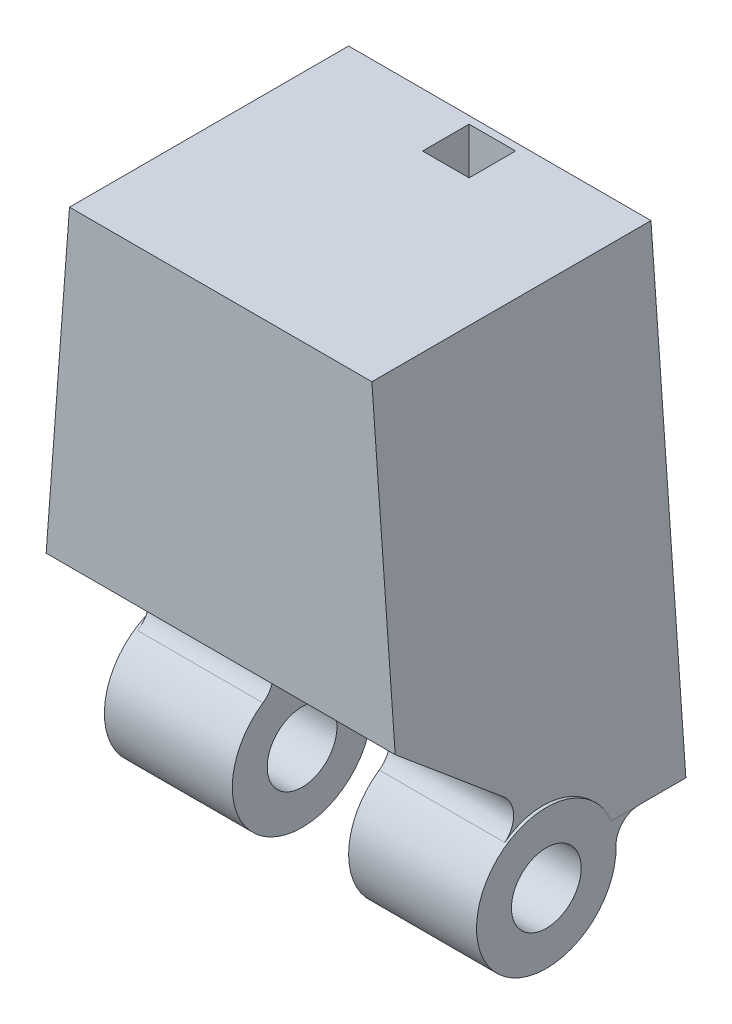
ISO-10303-21;
HEADER;
FILE_DESCRIPTION(('STEP AP214'),'2;1');
FILE_NAME('part.step','',(''),(''),'','','');
FILE_SCHEMA(('AUTOMOTIVE_DESIGN { 1 0 10303 214 1 1 1 1 }'));
ENDSEC;
DATA;
#1=APPLICATION_CONTEXT('core data for automotive mechanical design processes');
#2=APPLICATION_PROTOCOL_DEFINITION('international standard','automotive_design',2000,#1);
#3=PRODUCT_CONTEXT('',#1,'mechanical');
#4=PRODUCT('Part','Part','',(#3));
#5=PRODUCT_RELATED_PRODUCT_CATEGORY('part','',(#4));
#6=PRODUCT_DEFINITION_FORMATION('','',#4);
#7=PRODUCT_DEFINITION_CONTEXT('part definition',#1,'design');
#8=PRODUCT_DEFINITION('design','',#6,#7);
#9=PRODUCT_DEFINITION_SHAPE('','',#8);
#10=(LENGTH_UNIT() NAMED_UNIT(*) SI_UNIT(.MILLI.,.METRE.));
#11=(NAMED_UNIT(*) PLANE_ANGLE_UNIT() SI_UNIT($,.RADIAN.));
#12=(NAMED_UNIT(*) SI_UNIT($,.STERADIAN.) SOLID_ANGLE_UNIT());
#13=UNCERTAINTY_MEASURE_WITH_UNIT(LENGTH_MEASURE(1.E-05),#10,'distance_accuracy_value','');
#14=(GEOMETRIC_REPRESENTATION_CONTEXT(3) GLOBAL_UNCERTAINTY_ASSIGNED_CONTEXT((#13)) GLOBAL_UNIT_ASSIGNED_CONTEXT((#10,
#11,#12)) REPRESENTATION_CONTEXT('',''));
#15=CARTESIAN_POINT('',(0.,0.,0.));
#16=DIRECTION('',(0.,0.,1.));
#17=DIRECTION('',(1.,0.,0.));
#18=AXIS2_PLACEMENT_3D('',#15,#16,#17);
#19=CARTESIAN_POINT('',(-8.,-10.,4.));
#20=DIRECTION('',(0.,0.770712909441233,-0.637182557216242));
#21=DIRECTION('',(0.,0.637182557216242,0.770712909441233));
#22=AXIS2_PLACEMENT_3D('',#19,#20,#21);
#23=PLANE('',#22);
#24=DIRECTION('',(-1.,0.,0.));
#25=VECTOR('',#24,1.);
#26=CARTESIAN_POINT('',(8.,-8.11329221864349,6.28209329801413));
#27=LINE('',#26,#25);
#28=CARTESIAN_POINT('',(2.5,-8.11329221864349,6.28209329801413));
#29=VERTEX_POINT('',#28);
#30=CARTESIAN_POINT('',(-2.5,-8.11329221864349,6.28209329801413));
#31=VERTEX_POINT('',#30);
#32=EDGE_CURVE('E374',#29,#31,#27,.T.);
#33=ORIENTED_EDGE('',*,*,#32,.F.);
#34=DIRECTION('',(0.,0.637182557216242,0.770712909441233));
#35=VECTOR('',#34,1.);
#36=CARTESIAN_POINT('',(2.5,-9.46443212730802,4.64780347278967));
#37=LINE('',#36,#35);
#38=CARTESIAN_POINT('',(2.5,-7.01805096276244,7.60685739474015));
#39=VERTEX_POINT('',#38);
#40=EDGE_CURVE('E392',#29,#39,#37,.T.);
#41=ORIENTED_EDGE('',*,*,#40,.T.);
#42=DIRECTION('',(1.,0.,0.));
#43=VECTOR('',#42,1.);
#44=CARTESIAN_POINT('',(7.85849691639826,-7.01805096276244,7.60685739474015));
#45=LINE('',#44,#43);
#46=CARTESIAN_POINT('',(7.77635382220718,-7.01805096276244,7.60685739474015));
#47=VERTEX_POINT('',#46);
#48=EDGE_CURVE('E389',#39,#47,#45,.T.);
#49=ORIENTED_EDGE('',*,*,#48,.T.);
#50=DIRECTION('',(0.0477342161514117,-0.636456215352155,-0.769834352668171));
#51=VECTOR('',#50,1.);
#52=CARTESIAN_POINT('',(7.70602048487164,-6.08027313162191,8.74115944438417));
#53=LINE('',#52,#51);
#54=CARTESIAN_POINT('',(7.50395337920715,-3.3860450560954,12.));
#55=VERTEX_POINT('',#54);
#56=EDGE_CURVE('E330',#55,#47,#53,.T.);
#57=ORIENTED_EDGE('',*,*,#56,.F.);
#58=DIRECTION('',(-1.,0.,0.));
#59=VECTOR('',#58,1.);
#60=CARTESIAN_POINT('',(0.,-3.3860450560954,12.));
#61=LINE('',#60,#59);
#62=CARTESIAN_POINT('',(-7.50395337920716,-3.3860450560954,12.));
#63=VERTEX_POINT('',#62);
#64=EDGE_CURVE('E370',#55,#63,#61,.T.);
#65=ORIENTED_EDGE('',*,*,#64,.T.);
#66=DIRECTION('',(0.0477342161514115,0.636456215352155,0.769834352668171));
#67=VECTOR('',#66,1.);
#68=CARTESIAN_POINT('',(-7.70602048487164,-6.08027313162192,8.74115944438417));
#69=LINE('',#68,#67);
#70=CARTESIAN_POINT('',(-7.77635382220718,-7.01805096276244,7.60685739474015));
#71=VERTEX_POINT('',#70);
#72=EDGE_CURVE('E334',#71,#63,#69,.T.);
#73=ORIENTED_EDGE('',*,*,#72,.F.);
#74=DIRECTION('',(1.,0.,0.));
#75=VECTOR('',#74,1.);
#76=CARTESIAN_POINT('',(-2.5,-7.01805096276244,7.60685739474015));
#77=LINE('',#76,#75);
#78=CARTESIAN_POINT('',(-2.5,-7.01805096276244,7.60685739474015));
#79=VERTEX_POINT('',#78);
#80=EDGE_CURVE('E385',#71,#79,#77,.T.);
#81=ORIENTED_EDGE('',*,*,#80,.T.);
#82=DIRECTION('',(0.,-0.637182557216242,-0.770712909441233));
#83=VECTOR('',#82,1.);
#84=CARTESIAN_POINT('',(-2.5,-10.,4.));
#85=LINE('',#84,#83);
#86=EDGE_CURVE('E382',#79,#31,#85,.T.);
#87=ORIENTED_EDGE('',*,*,#86,.T.);
#88=EDGE_LOOP('',(#33,#41,#49,#57,#65,#73,#81,#87));
#89=FACE_BOUND('',#88,.T.);
#90=DIRECTION('',(1.,0.,0.));
#91=VECTOR('',#90,1.);
#92=CARTESIAN_POINT('',(0.,-4.15066412475489,11.0751445086705));
#93=LINE('',#92,#91);
#94=CARTESIAN_POINT('',(-5.,-4.15066412475489,11.0751445086705));
#95=VERTEX_POINT('',#94);
#96=CARTESIAN_POINT('',(5.,-4.15066412475489,11.0751445086705));
#97=VERTEX_POINT('',#96);
#98=EDGE_CURVE('E239',#95,#97,#93,.T.);
#99=ORIENTED_EDGE('',*,*,#98,.T.);
#100=DIRECTION('',(0.,-0.637182557216242,-0.770712909441233));
#101=VECTOR('',#100,1.);
#102=CARTESIAN_POINT('',(5.,-7.90432317786304,6.53485467005587));
#103=LINE('',#102,#101);
#104=CARTESIAN_POINT('',(5.,-6.69939435361986,7.99229287090559));
#105=VERTEX_POINT('',#104);
#106=EDGE_CURVE('E245',#97,#105,#103,.T.);
#107=ORIENTED_EDGE('',*,*,#106,.T.);
#108=DIRECTION('',(-1.,0.,0.));
#109=VECTOR('',#108,1.);
#110=CARTESIAN_POINT('',(0.,-6.69939435361986,7.99229287090559));
#111=LINE('',#110,#109);
#112=CARTESIAN_POINT('',(-5.,-6.69939435361986,7.99229287090559));
#113=VERTEX_POINT('',#112);
#114=EDGE_CURVE('E262',#105,#113,#111,.T.);
#115=ORIENTED_EDGE('',*,*,#114,.T.);
#116=DIRECTION('',(0.,0.637182557216242,0.770712909441233));
#117=VECTOR('',#116,1.);
#118=CARTESIAN_POINT('',(-5.,-7.90432317786304,6.53485467005587));
#119=LINE('',#118,#117);
#120=EDGE_CURVE('E258',#113,#95,#119,.T.);
#121=ORIENTED_EDGE('',*,*,#120,.T.);
#122=EDGE_LOOP('',(#99,#107,#115,#121));
#123=FACE_BOUND('',#122,.T.);
#124=ADVANCED_FACE('F40',(#89,#123),#23,.F.);
#125=CARTESIAN_POINT('',(8.,-11.1,6.));
#126=DIRECTION('',(-1.,0.,0.));
#127=DIRECTION('',(0.,0.,1.));
#128=AXIS2_PLACEMENT_3D('',#125,#126,#127);
#129=CYLINDRICAL_SURFACE('',#128,3.);
#130=CARTESIAN_POINT('',(-8.,-11.1,6.));
#131=DIRECTION('',(1.,0.,0.));
#132=DIRECTION('',(0.,0.,-1.));
#133=AXIS2_PLACEMENT_3D('',#130,#131,#132);
#134=CIRCLE('',#133,3.);
#135=CARTESIAN_POINT('',(-8.,-10.,3.20894285260943));
#136=VERTEX_POINT('',#135);
#137=CARTESIAN_POINT('',(-8.,-11.025,3.00093764653017));
#138=VERTEX_POINT('',#137);
#139=EDGE_CURVE('E309',#136,#138,#134,.T.);
#140=ORIENTED_EDGE('',*,*,#139,.T.);
#141=DIRECTION('',(-1.,0.,0.));
#142=VECTOR('',#141,1.);
#143=CARTESIAN_POINT('',(8.,-11.025,3.00093764653017));
#144=LINE('',#143,#142);
#145=CARTESIAN_POINT('',(-2.5,-11.025,3.00093764653017));
#146=VERTEX_POINT('',#145);
#147=EDGE_CURVE('E432',#138,#146,#144,.F.);
#148=ORIENTED_EDGE('',*,*,#147,.T.);
#149=CARTESIAN_POINT('',(-2.5,-11.1,6.));
#150=DIRECTION('',(1.,0.,0.));
#151=DIRECTION('',(0.,0.,-1.));
#152=AXIS2_PLACEMENT_3D('',#149,#150,#151);
#153=CIRCLE('',#152,3.);
#154=CARTESIAN_POINT('',(-2.5,-8.61657290415276,7.68302996396729));
#155=VERTEX_POINT('',#154);
#156=EDGE_CURVE('E299',#155,#146,#153,.T.);
#157=ORIENTED_EDGE('',*,*,#156,.F.);
#158=DIRECTION('',(-1.,0.,0.));
#159=VECTOR('',#158,1.);
#160=CARTESIAN_POINT('',(8.,-8.61657290415276,7.68302996396729));
#161=LINE('',#160,#159);
#162=CARTESIAN_POINT('',(-7.89624296781146,-8.61657290415276,7.68302996396729));
#163=VERTEX_POINT('',#162);
#164=EDGE_CURVE('E396',#155,#163,#161,.T.);
#165=ORIENTED_EDGE('',*,*,#164,.T.);
#166=CARTESIAN_POINT('',(-8.0825,-11.1,6.));
#167=DIRECTION('',(0.997199309888456,-0.074789948241634,0.));
#168=DIRECTION('',(-0.074789948241634,-0.997199309888456,0.));
#169=AXIS2_PLACEMENT_3D('',#166,#167,#168);
#170=ELLIPSE('',#169,3.00842566801974,3.);
#171=EDGE_CURVE('E326',#163,#136,#170,.F.);
#172=ORIENTED_EDGE('',*,*,#171,.T.);
#173=EDGE_LOOP('',(#140,#148,#157,#165,#172));
#174=FACE_BOUND('',#173,.T.);
#175=ADVANCED_FACE('F485',(#174),#129,.T.);
#176=CARTESIAN_POINT('',(8.,-11.1,6.));
#177=DIRECTION('',(-1.,0.,0.));
#178=DIRECTION('',(0.,0.,1.));
#179=AXIS2_PLACEMENT_3D('',#176,#177,#178);
#180=CYLINDRICAL_SURFACE('',#179,1.5);
#181=CARTESIAN_POINT('',(-8.,-11.1,6.));
#182=DIRECTION('',(1.,0.,0.));
#183=DIRECTION('',(0.,0.,-1.));
#184=AXIS2_PLACEMENT_3D('',#181,#182,#183);
#185=CIRCLE('',#184,1.5);
#186=CARTESIAN_POINT('',(-8.,-11.1,4.5));
#187=VERTEX_POINT('',#186);
#188=EDGE_CURVE('E298',#187,#187,#185,.T.);
#189=ORIENTED_EDGE('',*,*,#188,.F.);
#190=EDGE_LOOP('',(#189));
#191=FACE_BOUND('',#190,.T.);
#192=CARTESIAN_POINT('',(-2.5,-11.1,6.));
#193=DIRECTION('',(1.,0.,0.));
#194=DIRECTION('',(0.,0.,-1.));
#195=AXIS2_PLACEMENT_3D('',#192,#193,#194);
#196=CIRCLE('',#195,1.5);
#197=CARTESIAN_POINT('',(-2.5,-11.1,4.5));
#198=VERTEX_POINT('',#197);
#199=EDGE_CURVE('E286',#198,#198,#196,.T.);
#200=ORIENTED_EDGE('',*,*,#199,.T.);
#201=EDGE_LOOP('',(#200));
#202=FACE_BOUND('',#201,.T.);
#203=ADVANCED_FACE('F493',(#191,#202),#180,.F.);
#204=CARTESIAN_POINT('',(-8.,-10.,12.));
#205=DIRECTION('',(0.997199309888456,-0.074789948241634,0.));
#206=DIRECTION('',(0.074789948241634,0.997199309888456,0.));
#207=AXIS2_PLACEMENT_3D('',#204,#205,#206);
#208=PLANE('',#207);
#209=ORIENTED_EDGE('',*,*,#171,.F.);
#210=CARTESIAN_POINT('',(-7.83415729041528,-7.78876387220367,8.24403995195639));
#211=DIRECTION('',(0.997199309888456,-0.074789948241634,0.));
#212=DIRECTION('',(-0.074789948241634,-0.997199309888456,0.));
#213=AXIS2_PLACEMENT_3D('',#210,#211,#212);
#214=ELLIPSE('',#213,1.00280855600658,1.);
#215=EDGE_CURVE('E407',#163,#71,#214,.T.);
#216=ORIENTED_EDGE('',*,*,#215,.T.);
#217=ORIENTED_EDGE('',*,*,#72,.T.);
#218=DIRECTION('',(-0.074789948241634,-0.997199309888456,0.));
#219=VECTOR('',#218,1.);
#220=CARTESIAN_POINT('',(-8.,-10.,12.));
#221=LINE('',#220,#219);
#222=CARTESIAN_POINT('',(-6.5,10.,12.));
#223=VERTEX_POINT('',#222);
#224=EDGE_CURVE('E338',#223,#63,#221,.T.);
#225=ORIENTED_EDGE('',*,*,#224,.F.);
#226=DIRECTION('',(0.,0.,-1.));
#227=VECTOR('',#226,1.);
#228=CARTESIAN_POINT('',(-6.5,10.,12.));
#229=LINE('',#228,#227);
#230=CARTESIAN_POINT('',(-6.5,10.,0.));
#231=VERTEX_POINT('',#230);
#232=EDGE_CURVE('E366',#223,#231,#229,.T.);
#233=ORIENTED_EDGE('',*,*,#232,.T.);
#234=DIRECTION('',(-0.074789948241634,-0.997199309888456,0.));
#235=VECTOR('',#234,1.);
#236=CARTESIAN_POINT('',(-8.,-10.,0.));
#237=LINE('',#236,#235);
#238=CARTESIAN_POINT('',(-8.,-10.,0.));
#239=VERTEX_POINT('',#238);
#240=EDGE_CURVE('E337',#231,#239,#237,.T.);
#241=ORIENTED_EDGE('',*,*,#240,.T.);
#242=DIRECTION('',(0.,0.,-1.));
#243=VECTOR('',#242,1.);
#244=CARTESIAN_POINT('',(-8.,-10.,12.));
#245=LINE('',#244,#243);
#246=CARTESIAN_POINT('',(-8.,-10.,2.00125482023964));
#247=VERTEX_POINT('',#246);
#248=EDGE_CURVE('E363',#247,#239,#245,.T.);
#249=ORIENTED_EDGE('',*,*,#248,.F.);
#250=DIRECTION('',(0.,0.,-1.));
#251=VECTOR('',#250,1.);
#252=CARTESIAN_POINT('',(-8.,-10.,0.));
#253=LINE('',#252,#251);
#254=EDGE_CURVE('E453',#136,#247,#253,.T.);
#255=ORIENTED_EDGE('',*,*,#254,.F.);
#256=EDGE_LOOP('',(#209,#216,#217,#225,#233,#241,#249,#255));
#257=FACE_BOUND('',#256,.T.);
#258=ADVANCED_FACE('F515',(#257),#208,.F.);
#259=CARTESIAN_POINT('',(-8.,-10.,12.));
#260=DIRECTION('',(0.,1.,0.));
#261=DIRECTION('',(-1.,0.,0.));
#262=AXIS2_PLACEMENT_3D('',#259,#260,#261);
#263=PLANE('',#262);
#264=DIRECTION('',(1.,0.,0.));
#265=VECTOR('',#264,1.);
#266=CARTESIAN_POINT('',(-1.,-9.99999999999999,0.32));
#267=LINE('',#266,#265);
#268=CARTESIAN_POINT('',(-1.,-9.99999999999999,0.32));
#269=VERTEX_POINT('',#268);
#270=CARTESIAN_POINT('',(1.,-10.,0.319999999999999));
#271=VERTEX_POINT('',#270);
#272=EDGE_CURVE('E212',#269,#271,#267,.T.);
#273=ORIENTED_EDGE('',*,*,#272,.F.);
#274=DIRECTION('',(0.,0.,-1.));
#275=VECTOR('',#274,1.);
#276=CARTESIAN_POINT('',(-1.,-9.99999999999999,0.32));
#277=LINE('',#276,#275);
#278=CARTESIAN_POINT('',(-1.,-10.,2.32));
#279=VERTEX_POINT('',#278);
#280=EDGE_CURVE('E200',#279,#269,#277,.T.);
#281=ORIENTED_EDGE('',*,*,#280,.F.);
#282=DIRECTION('',(1.,0.,0.));
#283=VECTOR('',#282,1.);
#284=CARTESIAN_POINT('',(-1.,-10.,2.32));
#285=LINE('',#284,#283);
#286=CARTESIAN_POINT('',(1.,-10.,2.32));
#287=VERTEX_POINT('',#286);
#288=EDGE_CURVE('E207',#279,#287,#285,.T.);
#289=ORIENTED_EDGE('',*,*,#288,.T.);
#290=DIRECTION('',(0.,0.,-1.));
#291=VECTOR('',#290,1.);
#292=CARTESIAN_POINT('',(1.,-9.99999999999999,0.32));
#293=LINE('',#292,#291);
#294=EDGE_CURVE('E224',#287,#271,#293,.T.);
#295=ORIENTED_EDGE('',*,*,#294,.T.);
#296=EDGE_LOOP('',(#273,#281,#289,#295));
#297=FACE_BOUND('',#296,.T.);
#298=DIRECTION('',(0.,0.,-1.));
#299=VECTOR('',#298,1.);
#300=CARTESIAN_POINT('',(8.,-10.,12.));
#301=LINE('',#300,#299);
#302=CARTESIAN_POINT('',(8.,-10.,2.00125019537356));
#303=VERTEX_POINT('',#302);
#304=CARTESIAN_POINT('',(8.,-10.,0.));
#305=VERTEX_POINT('',#304);
#306=EDGE_CURVE('E360',#303,#305,#301,.T.);
#307=ORIENTED_EDGE('',*,*,#306,.F.);
#308=DIRECTION('',(1.,0.,0.));
#309=VECTOR('',#308,1.);
#310=CARTESIAN_POINT('',(2.5,-10.,2.00125019537356));
#311=LINE('',#310,#309);
#312=CARTESIAN_POINT('',(2.5,-10.,2.00125019537356));
#313=VERTEX_POINT('',#312);
#314=EDGE_CURVE('E428',#303,#313,#311,.F.);
#315=ORIENTED_EDGE('',*,*,#314,.T.);
#316=DIRECTION('',(0.,0.,1.));
#317=VECTOR('',#316,1.);
#318=CARTESIAN_POINT('',(2.5,-10.,6.));
#319=LINE('',#318,#317);
#320=CARTESIAN_POINT('',(2.5,-10.,3.20894285260943));
#321=VERTEX_POINT('',#320);
#322=EDGE_CURVE('E425',#313,#321,#319,.T.);
#323=ORIENTED_EDGE('',*,*,#322,.T.);
#324=DIRECTION('',(-1.,0.,0.));
#325=VECTOR('',#324,1.);
#326=CARTESIAN_POINT('',(8.,-10.,3.20894285260943));
#327=LINE('',#326,#325);
#328=CARTESIAN_POINT('',(-2.5,-10.,3.20894285260943));
#329=VERTEX_POINT('',#328);
#330=EDGE_CURVE('E322',#329,#321,#327,.F.);
#331=ORIENTED_EDGE('',*,*,#330,.F.);
#332=DIRECTION('',(0.,0.,-1.));
#333=VECTOR('',#332,1.);
#334=CARTESIAN_POINT('',(-2.5,-10.,12.));
#335=LINE('',#334,#333);
#336=CARTESIAN_POINT('',(-2.5,-10.,2.00125019537356));
#337=VERTEX_POINT('',#336);
#338=EDGE_CURVE('E421',#329,#337,#335,.T.);
#339=ORIENTED_EDGE('',*,*,#338,.T.);
#340=DIRECTION('',(1.,0.,0.));
#341=VECTOR('',#340,1.);
#342=CARTESIAN_POINT('',(-8.,-10.,2.00125019537356));
#343=LINE('',#342,#341);
#344=EDGE_CURVE('E417',#337,#247,#343,.F.);
#345=ORIENTED_EDGE('',*,*,#344,.T.);
#346=ORIENTED_EDGE('',*,*,#248,.T.);
#347=DIRECTION('',(1.,0.,0.));
#348=VECTOR('',#347,1.);
#349=CARTESIAN_POINT('',(-8.,-10.,0.));
#350=LINE('',#349,#348);
#351=EDGE_CURVE('E351',#239,#305,#350,.T.);
#352=ORIENTED_EDGE('',*,*,#351,.T.);
#353=EDGE_LOOP('',(#307,#315,#323,#331,#339,#345,#346,#352));
#354=FACE_BOUND('',#353,.T.);
#355=ADVANCED_FACE('F215',(#297,#354),#263,.F.);
#356=CARTESIAN_POINT('',(8.,-10.,12.));
#357=DIRECTION('',(-0.997199309888456,-0.0747899482416344,0.));
#358=DIRECTION('',(0.0747899482416344,-0.997199309888456,0.));
#359=AXIS2_PLACEMENT_3D('',#356,#357,#358);
#360=PLANE('',#359);
#361=CARTESIAN_POINT('',(8.0825,-11.1,6.));
#362=DIRECTION('',(-0.997199309888456,-0.0747899482416344,0.));
#363=DIRECTION('',(-0.0747899482416344,0.997199309888456,0.));
#364=AXIS2_PLACEMENT_3D('',#361,#362,#363);
#365=ELLIPSE('',#364,3.00842566801974,3.);
#366=CARTESIAN_POINT('',(8.,-10.,3.20894285260943));
#367=VERTEX_POINT('',#366);
#368=CARTESIAN_POINT('',(7.89624296781146,-8.61657290415276,7.68302996396729));
#369=VERTEX_POINT('',#368);
#370=EDGE_CURVE('E313',#367,#369,#365,.F.);
#371=ORIENTED_EDGE('',*,*,#370,.F.);
#372=DIRECTION('',(0.,0.,-1.));
#373=VECTOR('',#372,1.);
#374=CARTESIAN_POINT('',(8.,-10.,0.));
#375=LINE('',#374,#373);
#376=EDGE_CURVE('E449',#367,#303,#375,.T.);
#377=ORIENTED_EDGE('',*,*,#376,.T.);
#378=ORIENTED_EDGE('',*,*,#306,.T.);
#379=DIRECTION('',(-0.0747899482416344,0.997199309888457,0.));
#380=VECTOR('',#379,1.);
#381=CARTESIAN_POINT('',(8.,-10.,0.));
#382=LINE('',#381,#380);
#383=CARTESIAN_POINT('',(6.5,10.,0.));
#384=VERTEX_POINT('',#383);
#385=EDGE_CURVE('E343',#305,#384,#382,.T.);
#386=ORIENTED_EDGE('',*,*,#385,.T.);
#387=DIRECTION('',(0.,0.,-1.));
#388=VECTOR('',#387,1.);
#389=CARTESIAN_POINT('',(6.5,10.,12.));
#390=LINE('',#389,#388);
#391=CARTESIAN_POINT('',(6.5,10.,12.));
#392=VERTEX_POINT('',#391);
#393=EDGE_CURVE('E347',#392,#384,#390,.T.);
#394=ORIENTED_EDGE('',*,*,#393,.F.);
#395=DIRECTION('',(-0.0747899482416344,0.997199309888457,0.));
#396=VECTOR('',#395,1.);
#397=CARTESIAN_POINT('',(8.,-10.,12.));
#398=LINE('',#397,#396);
#399=EDGE_CURVE('E342',#55,#392,#398,.T.);
#400=ORIENTED_EDGE('',*,*,#399,.F.);
#401=ORIENTED_EDGE('',*,*,#56,.T.);
#402=CARTESIAN_POINT('',(7.83415729041528,-7.78876387220367,8.24403995195639));
#403=DIRECTION('',(-0.997199309888456,-0.0747899482416344,0.));
#404=DIRECTION('',(-0.0747899482416344,0.997199309888456,0.));
#405=AXIS2_PLACEMENT_3D('',#402,#403,#404);
#406=ELLIPSE('',#405,1.00280855600658,1.);
#407=EDGE_CURVE('E403',#47,#369,#406,.T.);
#408=ORIENTED_EDGE('',*,*,#407,.T.);
#409=EDGE_LOOP('',(#371,#377,#378,#386,#394,#400,#401,#408));
#410=FACE_BOUND('',#409,.T.);
#411=ADVANCED_FACE('F506',(#410),#360,.F.);
#412=CARTESIAN_POINT('',(0.,10.,12.));
#413=DIRECTION('',(0.,0.,1.));
#414=DIRECTION('',(1.,0.,0.));
#415=AXIS2_PLACEMENT_3D('',#412,#413,#414);
#416=PLANE('',#415);
#417=DIRECTION('',(1.,0.,0.));
#418=VECTOR('',#417,1.);
#419=CARTESIAN_POINT('',(-8.,10.,12.));
#420=LINE('',#419,#418);
#421=EDGE_CURVE('E273',#223,#392,#420,.T.);
#422=ORIENTED_EDGE('',*,*,#421,.F.);
#423=ORIENTED_EDGE('',*,*,#224,.T.);
#424=ORIENTED_EDGE('',*,*,#64,.F.);
#425=ORIENTED_EDGE('',*,*,#399,.T.);
#426=EDGE_LOOP('',(#422,#423,#424,#425));
#427=FACE_BOUND('',#426,.T.);
#428=ADVANCED_FACE('F502',(#427),#416,.T.);
#429=CARTESIAN_POINT('',(0.,10.,0.));
#430=DIRECTION('',(0.,0.,1.));
#431=DIRECTION('',(1.,0.,0.));
#432=AXIS2_PLACEMENT_3D('',#429,#430,#431);
#433=PLANE('',#432);
#434=ORIENTED_EDGE('',*,*,#240,.F.);
#435=DIRECTION('',(1.,0.,0.));
#436=VECTOR('',#435,1.);
#437=CARTESIAN_POINT('',(0.,10.,0.));
#438=LINE('',#437,#436);
#439=EDGE_CURVE('E456',#231,#384,#438,.T.);
#440=ORIENTED_EDGE('',*,*,#439,.T.);
#441=ORIENTED_EDGE('',*,*,#385,.F.);
#442=ORIENTED_EDGE('',*,*,#351,.F.);
#443=EDGE_LOOP('',(#434,#440,#441,#442));
#444=FACE_BOUND('',#443,.T.);
#445=ADVANCED_FACE('F505',(#444),#433,.F.);
#446=CARTESIAN_POINT('',(2.5,-11.1,6.));
#447=DIRECTION('',(1.,0.,0.));
#448=DIRECTION('',(0.,0.,-1.));
#449=AXIS2_PLACEMENT_3D('',#446,#447,#448);
#450=CIRCLE('',#449,3.);
#451=CARTESIAN_POINT('',(2.5,-8.61657290415276,7.68302996396729));
#452=VERTEX_POINT('',#451);
#453=CARTESIAN_POINT('',(2.5,-11.025,3.00093764653017));
#454=VERTEX_POINT('',#453);
#455=EDGE_CURVE('E290',#452,#454,#450,.T.);
#456=ORIENTED_EDGE('',*,*,#455,.T.);
#457=DIRECTION('',(-1.,0.,0.));
#458=VECTOR('',#457,1.);
#459=CARTESIAN_POINT('',(8.,-11.025,3.00093764653017));
#460=LINE('',#459,#458);
#461=CARTESIAN_POINT('',(8.,-11.025,3.00093764653017));
#462=VERTEX_POINT('',#461);
#463=EDGE_CURVE('E413',#454,#462,#460,.F.);
#464=ORIENTED_EDGE('',*,*,#463,.T.);
#465=CARTESIAN_POINT('',(8.,-11.1,6.));
#466=DIRECTION('',(1.,0.,0.));
#467=DIRECTION('',(0.,0.,-1.));
#468=AXIS2_PLACEMENT_3D('',#465,#466,#467);
#469=CIRCLE('',#468,3.);
#470=EDGE_CURVE('E308',#367,#462,#469,.T.);
#471=ORIENTED_EDGE('',*,*,#470,.F.);
#472=ORIENTED_EDGE('',*,*,#370,.T.);
#473=DIRECTION('',(-1.,0.,0.));
#474=VECTOR('',#473,1.);
#475=CARTESIAN_POINT('',(8.,-8.61657290415276,7.68302996396729));
#476=LINE('',#475,#474);
#477=EDGE_CURVE('E378',#369,#452,#476,.T.);
#478=ORIENTED_EDGE('',*,*,#477,.T.);
#479=EDGE_LOOP('',(#456,#464,#471,#472,#478));
#480=FACE_BOUND('',#479,.T.);
#481=ADVANCED_FACE('F496',(#480),#129,.T.);
#482=CARTESIAN_POINT('',(2.5,-11.1,6.));
#483=DIRECTION('',(1.,0.,0.));
#484=DIRECTION('',(0.,0.,-1.));
#485=AXIS2_PLACEMENT_3D('',#482,#483,#484);
#486=CIRCLE('',#485,1.5);
#487=CARTESIAN_POINT('',(2.5,-11.1,4.5));
#488=VERTEX_POINT('',#487);
#489=EDGE_CURVE('E285',#488,#488,#486,.T.);
#490=ORIENTED_EDGE('',*,*,#489,.F.);
#491=EDGE_LOOP('',(#490));
#492=FACE_BOUND('',#491,.T.);
#493=CARTESIAN_POINT('',(8.,-11.1,6.));
#494=DIRECTION('',(1.,0.,0.));
#495=DIRECTION('',(0.,0.,-1.));
#496=AXIS2_PLACEMENT_3D('',#493,#494,#495);
#497=CIRCLE('',#496,1.5);
#498=CARTESIAN_POINT('',(8.,-11.1,4.5));
#499=VERTEX_POINT('',#498);
#500=EDGE_CURVE('E304',#499,#499,#497,.T.);
#501=ORIENTED_EDGE('',*,*,#500,.T.);
#502=EDGE_LOOP('',(#501));
#503=FACE_BOUND('',#502,.T.);
#504=ADVANCED_FACE('F501',(#492,#503),#180,.F.);
#505=CARTESIAN_POINT('',(8.,0.,0.));
#506=DIRECTION('',(1.,0.,0.));
#507=DIRECTION('',(0.,0.,-1.));
#508=AXIS2_PLACEMENT_3D('',#505,#506,#507);
#509=PLANE('',#508);
#510=ORIENTED_EDGE('',*,*,#500,.F.);
#511=EDGE_LOOP('',(#510));
#512=FACE_BOUND('',#511,.T.);
#513=ORIENTED_EDGE('',*,*,#470,.T.);
#514=CARTESIAN_POINT('',(8.,-11.,2.00125019537356));
#515=DIRECTION('',(1.,0.,0.));
#516=DIRECTION('',(0.,0.,-1.));
#517=AXIS2_PLACEMENT_3D('',#514,#515,#516);
#518=CIRCLE('',#517,1.);
#519=EDGE_CURVE('E436',#462,#303,#518,.F.);
#520=ORIENTED_EDGE('',*,*,#519,.T.);
#521=ORIENTED_EDGE('',*,*,#376,.F.);
#522=EDGE_LOOP('',(#513,#520,#521));
#523=FACE_BOUND('',#522,.T.);
#524=ADVANCED_FACE('F573',(#512,#523),#509,.T.);
#525=CARTESIAN_POINT('',(-8.,0.,0.));
#526=DIRECTION('',(1.,0.,0.));
#527=DIRECTION('',(0.,0.,-1.));
#528=AXIS2_PLACEMENT_3D('',#525,#526,#527);
#529=PLANE('',#528);
#530=ORIENTED_EDGE('',*,*,#139,.F.);
#531=ORIENTED_EDGE('',*,*,#254,.T.);
#532=CARTESIAN_POINT('',(-8.,-11.,2.00125019537356));
#533=DIRECTION('',(1.,0.,0.));
#534=DIRECTION('',(0.,0.,-1.));
#535=AXIS2_PLACEMENT_3D('',#532,#533,#534);
#536=CIRCLE('',#535,1.);
#537=EDGE_CURVE('E446',#247,#138,#536,.T.);
#538=ORIENTED_EDGE('',*,*,#537,.T.);
#539=EDGE_LOOP('',(#530,#531,#538));
#540=FACE_BOUND('',#539,.T.);
#541=ORIENTED_EDGE('',*,*,#188,.T.);
#542=EDGE_LOOP('',(#541));
#543=FACE_BOUND('',#542,.T.);
#544=ADVANCED_FACE('F569',(#540,#543),#529,.F.);
#545=CARTESIAN_POINT('',(-2.5,-11.1,6.));
#546=DIRECTION('',(1.,0.,0.));
#547=DIRECTION('',(0.,0.,-1.));
#548=AXIS2_PLACEMENT_3D('',#545,#546,#547);
#549=CYLINDRICAL_SURFACE('',#548,3.);
#550=EDGE_CURVE('E300',#321,#29,#450,.T.);
#551=ORIENTED_EDGE('',*,*,#550,.T.);
#552=ORIENTED_EDGE('',*,*,#32,.T.);
#553=EDGE_CURVE('E294',#329,#31,#153,.T.);
#554=ORIENTED_EDGE('',*,*,#553,.F.);
#555=ORIENTED_EDGE('',*,*,#330,.T.);
#556=EDGE_LOOP('',(#551,#552,#554,#555));
#557=FACE_BOUND('',#556,.T.);
#558=ADVANCED_FACE('F572',(#557),#549,.F.);
#559=CARTESIAN_POINT('',(-2.5,-11.1,6.));
#560=DIRECTION('',(1.,0.,0.));
#561=DIRECTION('',(0.,0.,-1.));
#562=AXIS2_PLACEMENT_3D('',#559,#560,#561);
#563=PLANE('',#562);
#564=ORIENTED_EDGE('',*,*,#199,.F.);
#565=EDGE_LOOP('',(#564));
#566=FACE_BOUND('',#565,.T.);
#567=ORIENTED_EDGE('',*,*,#553,.T.);
#568=ORIENTED_EDGE('',*,*,#86,.F.);
#569=CARTESIAN_POINT('',(-2.5,-7.78876387220367,8.24403995195639));
#570=DIRECTION('',(1.,0.,0.));
#571=DIRECTION('',(0.,0.,-1.));
#572=AXIS2_PLACEMENT_3D('',#569,#570,#571);
#573=CIRCLE('',#572,1.);
#574=EDGE_CURVE('E410',#79,#155,#573,.F.);
#575=ORIENTED_EDGE('',*,*,#574,.T.);
#576=ORIENTED_EDGE('',*,*,#156,.T.);
#577=CARTESIAN_POINT('',(-2.5,-11.,2.00125019537356));
#578=DIRECTION('',(1.,0.,0.));
#579=DIRECTION('',(0.,0.,-1.));
#580=AXIS2_PLACEMENT_3D('',#577,#578,#579);
#581=CIRCLE('',#580,1.);
#582=EDGE_CURVE('E443',#146,#337,#581,.F.);
#583=ORIENTED_EDGE('',*,*,#582,.T.);
#584=ORIENTED_EDGE('',*,*,#338,.F.);
#585=EDGE_LOOP('',(#567,#568,#575,#576,#583,#584));
#586=FACE_BOUND('',#585,.T.);
#587=ADVANCED_FACE('F549',(#566,#586),#563,.T.);
#588=CARTESIAN_POINT('',(2.5,-11.1,6.));
#589=DIRECTION('',(1.,0.,0.));
#590=DIRECTION('',(0.,0.,-1.));
#591=AXIS2_PLACEMENT_3D('',#588,#589,#590);
#592=PLANE('',#591);
#593=ORIENTED_EDGE('',*,*,#489,.T.);
#594=EDGE_LOOP('',(#593));
#595=FACE_BOUND('',#594,.T.);
#596=ORIENTED_EDGE('',*,*,#550,.F.);
#597=ORIENTED_EDGE('',*,*,#322,.F.);
#598=CARTESIAN_POINT('',(2.5,-11.,2.00125019537356));
#599=DIRECTION('',(1.,0.,0.));
#600=DIRECTION('',(0.,0.,-1.));
#601=AXIS2_PLACEMENT_3D('',#598,#599,#600);
#602=CIRCLE('',#601,1.);
#603=EDGE_CURVE('E440',#313,#454,#602,.T.);
#604=ORIENTED_EDGE('',*,*,#603,.T.);
#605=ORIENTED_EDGE('',*,*,#455,.F.);
#606=CARTESIAN_POINT('',(2.5,-7.78876387220367,8.24403995195639));
#607=DIRECTION('',(1.,0.,0.));
#608=DIRECTION('',(0.,0.,-1.));
#609=AXIS2_PLACEMENT_3D('',#606,#607,#608);
#610=CIRCLE('',#609,1.);
#611=EDGE_CURVE('E400',#452,#39,#610,.T.);
#612=ORIENTED_EDGE('',*,*,#611,.T.);
#613=ORIENTED_EDGE('',*,*,#40,.F.);
#614=EDGE_LOOP('',(#596,#597,#604,#605,#612,#613));
#615=FACE_BOUND('',#614,.T.);
#616=ADVANCED_FACE('F523',(#595,#615),#592,.F.);
#617=CARTESIAN_POINT('',(8.,-7.78876387220367,8.24403995195639));
#618=DIRECTION('',(-1.,0.,0.));
#619=DIRECTION('',(0.,0.,1.));
#620=AXIS2_PLACEMENT_3D('',#617,#618,#619);
#621=CYLINDRICAL_SURFACE('',#620,1.);
#622=ORIENTED_EDGE('',*,*,#407,.F.);
#623=ORIENTED_EDGE('',*,*,#48,.F.);
#624=ORIENTED_EDGE('',*,*,#611,.F.);
#625=ORIENTED_EDGE('',*,*,#477,.F.);
#626=EDGE_LOOP('',(#622,#623,#624,#625));
#627=FACE_BOUND('',#626,.T.);
#628=ADVANCED_FACE('F519',(#627),#621,.F.);
#629=CARTESIAN_POINT('',(8.,-7.78876387220367,8.24403995195639));
#630=DIRECTION('',(-1.,0.,0.));
#631=DIRECTION('',(0.,0.,1.));
#632=AXIS2_PLACEMENT_3D('',#629,#630,#631);
#633=CYLINDRICAL_SURFACE('',#632,1.);
#634=ORIENTED_EDGE('',*,*,#574,.F.);
#635=ORIENTED_EDGE('',*,*,#80,.F.);
#636=ORIENTED_EDGE('',*,*,#215,.F.);
#637=ORIENTED_EDGE('',*,*,#164,.F.);
#638=EDGE_LOOP('',(#634,#635,#636,#637));
#639=FACE_BOUND('',#638,.T.);
#640=ADVANCED_FACE('F522',(#639),#633,.F.);
#641=CARTESIAN_POINT('',(8.,-11.,2.00125019537356));
#642=DIRECTION('',(-1.,0.,0.));
#643=DIRECTION('',(0.,0.,1.));
#644=AXIS2_PLACEMENT_3D('',#641,#642,#643);
#645=CYLINDRICAL_SURFACE('',#644,1.);
#646=ORIENTED_EDGE('',*,*,#603,.F.);
#647=ORIENTED_EDGE('',*,*,#314,.F.);
#648=ORIENTED_EDGE('',*,*,#519,.F.);
#649=ORIENTED_EDGE('',*,*,#463,.F.);
#650=EDGE_LOOP('',(#646,#647,#648,#649));
#651=FACE_BOUND('',#650,.T.);
#652=ADVANCED_FACE('F526',(#651),#645,.F.);
#653=CARTESIAN_POINT('',(8.,-11.,2.00125019537356));
#654=DIRECTION('',(-1.,0.,0.));
#655=DIRECTION('',(0.,0.,1.));
#656=AXIS2_PLACEMENT_3D('',#653,#654,#655);
#657=CYLINDRICAL_SURFACE('',#656,1.);
#658=ORIENTED_EDGE('',*,*,#537,.F.);
#659=ORIENTED_EDGE('',*,*,#344,.F.);
#660=ORIENTED_EDGE('',*,*,#582,.F.);
#661=ORIENTED_EDGE('',*,*,#147,.F.);
#662=EDGE_LOOP('',(#658,#659,#660,#661));
#663=FACE_BOUND('',#662,.T.);
#664=ADVANCED_FACE('F42',(#663),#657,.F.);
#665=CARTESIAN_POINT('',(-8.,10.,12.));
#666=DIRECTION('',(0.,-1.,0.));
#667=DIRECTION('',(0.,0.,-1.));
#668=AXIS2_PLACEMENT_3D('',#665,#666,#667);
#669=PLANE('',#668);
#670=DIRECTION('',(-1.,0.,0.));
#671=VECTOR('',#670,1.);
#672=CARTESIAN_POINT('',(-8.,10.,2.32));
#673=LINE('',#672,#671);
#674=CARTESIAN_POINT('',(1.,10.,2.32));
#675=VERTEX_POINT('',#674);
#676=CARTESIAN_POINT('',(-1.,10.,2.32));
#677=VERTEX_POINT('',#676);
#678=EDGE_CURVE('E49',#675,#677,#673,.T.);
#679=ORIENTED_EDGE('',*,*,#678,.T.);
#680=DIRECTION('',(0.,0.,-1.));
#681=VECTOR('',#680,1.);
#682=CARTESIAN_POINT('',(-1.,10.,12.));
#683=LINE('',#682,#681);
#684=CARTESIAN_POINT('',(-1.,10.,0.32));
#685=VERTEX_POINT('',#684);
#686=EDGE_CURVE('E11',#677,#685,#683,.T.);
#687=ORIENTED_EDGE('',*,*,#686,.T.);
#688=DIRECTION('',(1.,0.,0.));
#689=VECTOR('',#688,1.);
#690=CARTESIAN_POINT('',(-8.,10.,0.320000000000001));
#691=LINE('',#690,#689);
#692=CARTESIAN_POINT('',(1.,10.,0.32));
#693=VERTEX_POINT('',#692);
#694=EDGE_CURVE('E463',#685,#693,#691,.T.);
#695=ORIENTED_EDGE('',*,*,#694,.T.);
#696=DIRECTION('',(0.,0.,-1.));
#697=VECTOR('',#696,1.);
#698=CARTESIAN_POINT('',(1.,10.,12.));
#699=LINE('',#698,#697);
#700=EDGE_CURVE('E460',#675,#693,#699,.T.);
#701=ORIENTED_EDGE('',*,*,#700,.F.);
#702=EDGE_LOOP('',(#679,#687,#695,#701));
#703=FACE_BOUND('',#702,.T.);
#704=ORIENTED_EDGE('',*,*,#421,.T.);
#705=ORIENTED_EDGE('',*,*,#393,.T.);
#706=ORIENTED_EDGE('',*,*,#439,.F.);
#707=ORIENTED_EDGE('',*,*,#232,.F.);
#708=EDGE_LOOP('',(#704,#705,#706,#707));
#709=FACE_BOUND('',#708,.T.);
#710=ADVANCED_FACE('F469',(#703,#709),#669,.F.);
#711=CARTESIAN_POINT('',(0.,-0.297099577548727,7.88923172258932));
#712=DIRECTION('',(0.,-0.637182557216242,-0.770712909441233));
#713=DIRECTION('',(0.,0.770712909441233,-0.637182557216242));
#714=AXIS2_PLACEMENT_3D('',#711,#712,#713);
#715=PLANE('',#714);
#716=ORIENTED_EDGE('',*,*,#98,.F.);
#717=DIRECTION('',(0.,-0.770712909441233,0.637182557216242));
#718=VECTOR('',#717,1.);
#719=CARTESIAN_POINT('',(-5.,-0.297099577548728,7.88923172258932));
#720=LINE('',#719,#718);
#721=CARTESIAN_POINT('',(-5.,-0.297099577548728,7.88923172258932));
#722=VERTEX_POINT('',#721);
#723=EDGE_CURVE('E254',#722,#95,#720,.T.);
#724=ORIENTED_EDGE('',*,*,#723,.F.);
#725=DIRECTION('',(1.,0.,0.));
#726=VECTOR('',#725,1.);
#727=CARTESIAN_POINT('',(0.,-0.297099577548727,7.88923172258932));
#728=LINE('',#727,#726);
#729=CARTESIAN_POINT('',(5.,-0.297099577548727,7.88923172258932));
#730=VERTEX_POINT('',#729);
#731=EDGE_CURVE('E240',#722,#730,#728,.T.);
#732=ORIENTED_EDGE('',*,*,#731,.T.);
#733=DIRECTION('',(0.,-0.770712909441233,0.637182557216242));
#734=VECTOR('',#733,1.);
#735=CARTESIAN_POINT('',(5.,-0.297099577548727,7.88923172258932));
#736=LINE('',#735,#734);
#737=EDGE_CURVE('E269',#730,#97,#736,.T.);
#738=ORIENTED_EDGE('',*,*,#737,.T.);
#739=EDGE_LOOP('',(#716,#724,#732,#738));
#740=FACE_BOUND('',#739,.T.);
#741=ADVANCED_FACE('F705',(#740),#715,.T.);
#742=CARTESIAN_POINT('',(5.,-4.05075863065688,3.34894188397466));
#743=DIRECTION('',(-1.,0.,0.));
#744=DIRECTION('',(0.,0.,1.));
#745=AXIS2_PLACEMENT_3D('',#742,#743,#744);
#746=PLANE('',#745);
#747=CARTESIAN_POINT('',(5.,-3.4982469655843,7.94076229674745));
#748=DIRECTION('',(-1.,0.,0.));
#749=DIRECTION('',(0.,0.,1.));
#750=AXIS2_PLACEMENT_3D('',#747,#748,#749);
#751=CIRCLE('',#750,1.5);
#752=CARTESIAN_POINT('',(5.,-3.4982469655843,9.44076229674745));
#753=VERTEX_POINT('',#752);
#754=EDGE_CURVE('E230',#753,#753,#751,.T.);
#755=ORIENTED_EDGE('',*,*,#754,.F.);
#756=EDGE_LOOP('',(#755));
#757=FACE_BOUND('',#756,.T.);
#758=ORIENTED_EDGE('',*,*,#106,.F.);
#759=ORIENTED_EDGE('',*,*,#737,.F.);
#760=DIRECTION('',(0.,-0.637182557216242,-0.770712909441233));
#761=VECTOR('',#760,1.);
#762=CARTESIAN_POINT('',(5.,-4.05075863065688,3.34894188397466));
#763=LINE('',#762,#761);
#764=CARTESIAN_POINT('',(5.,-2.8458298064137,4.80638008482438));
#765=VERTEX_POINT('',#764);
#766=EDGE_CURVE('E251',#730,#765,#763,.T.);
#767=ORIENTED_EDGE('',*,*,#766,.T.);
#768=DIRECTION('',(0.,-0.770712909441233,0.637182557216242));
#769=VECTOR('',#768,1.);
#770=CARTESIAN_POINT('',(5.,-2.8458298064137,4.80638008482438));
#771=LINE('',#770,#769);
#772=EDGE_CURVE('E274',#765,#105,#771,.T.);
#773=ORIENTED_EDGE('',*,*,#772,.T.);
#774=EDGE_LOOP('',(#758,#759,#767,#773));
#775=FACE_BOUND('',#774,.T.);
#776=ADVANCED_FACE('F755',(#757,#775),#746,.T.);
#777=CARTESIAN_POINT('',(0.,-2.8458298064137,4.80638008482438));
#778=DIRECTION('',(0.,0.637182557216242,0.770712909441233));
#779=DIRECTION('',(0.,-0.770712909441233,0.637182557216242));
#780=AXIS2_PLACEMENT_3D('',#777,#778,#779);
#781=PLANE('',#780);
#782=ORIENTED_EDGE('',*,*,#114,.F.);
#783=ORIENTED_EDGE('',*,*,#772,.F.);
#784=DIRECTION('',(-1.,0.,0.));
#785=VECTOR('',#784,1.);
#786=CARTESIAN_POINT('',(0.,-2.8458298064137,4.80638008482438));
#787=LINE('',#786,#785);
#788=CARTESIAN_POINT('',(-5.,-2.8458298064137,4.80638008482438));
#789=VERTEX_POINT('',#788);
#790=EDGE_CURVE('E248',#765,#789,#787,.T.);
#791=ORIENTED_EDGE('',*,*,#790,.T.);
#792=DIRECTION('',(0.,-0.770712909441233,0.637182557216242));
#793=VECTOR('',#792,1.);
#794=CARTESIAN_POINT('',(-5.,-2.8458298064137,4.80638008482438));
#795=LINE('',#794,#793);
#796=EDGE_CURVE('E277',#789,#113,#795,.T.);
#797=ORIENTED_EDGE('',*,*,#796,.T.);
#798=EDGE_LOOP('',(#782,#783,#791,#797));
#799=FACE_BOUND('',#798,.T.);
#800=ADVANCED_FACE('F748',(#799),#781,.T.);
#801=CARTESIAN_POINT('',(-5.,-4.05075863065688,3.34894188397466));
#802=DIRECTION('',(1.,0.,0.));
#803=DIRECTION('',(0.,0.,-1.));
#804=AXIS2_PLACEMENT_3D('',#801,#802,#803);
#805=PLANE('',#804);
#806=CARTESIAN_POINT('',(-5.,-3.4982469655843,7.94076229674745));
#807=DIRECTION('',(1.,0.,0.));
#808=DIRECTION('',(0.,0.,-1.));
#809=AXIS2_PLACEMENT_3D('',#806,#807,#808);
#810=CIRCLE('',#809,1.5);
#811=CARTESIAN_POINT('',(-5.,-3.4982469655843,9.44076229674745));
#812=VERTEX_POINT('',#811);
#813=EDGE_CURVE('E235',#812,#812,#810,.T.);
#814=ORIENTED_EDGE('',*,*,#813,.F.);
#815=EDGE_LOOP('',(#814));
#816=FACE_BOUND('',#815,.T.);
#817=ORIENTED_EDGE('',*,*,#120,.F.);
#818=ORIENTED_EDGE('',*,*,#796,.F.);
#819=DIRECTION('',(0.,0.637182557216242,0.770712909441233));
#820=VECTOR('',#819,1.);
#821=CARTESIAN_POINT('',(-5.,-4.05075863065688,3.34894188397466));
#822=LINE('',#821,#820);
#823=EDGE_CURVE('E244',#789,#722,#822,.T.);
#824=ORIENTED_EDGE('',*,*,#823,.T.);
#825=ORIENTED_EDGE('',*,*,#723,.T.);
#826=EDGE_LOOP('',(#817,#818,#824,#825));
#827=FACE_BOUND('',#826,.T.);
#828=ADVANCED_FACE('F739',(#816,#827),#805,.T.);
#829=CARTESIAN_POINT('',(0.,-4.05075863065688,3.34894188397466));
#830=DIRECTION('',(0.,-0.770712909441233,0.637182557216242));
#831=DIRECTION('',(0.,-0.637182557216242,-0.770712909441233));
#832=AXIS2_PLACEMENT_3D('',#829,#830,#831);
#833=PLANE('',#832);
#834=ORIENTED_EDGE('',*,*,#731,.F.);
#835=ORIENTED_EDGE('',*,*,#823,.F.);
#836=ORIENTED_EDGE('',*,*,#790,.F.);
#837=ORIENTED_EDGE('',*,*,#766,.F.);
#838=EDGE_LOOP('',(#834,#835,#836,#837));
#839=FACE_BOUND('',#838,.T.);
#840=ADVANCED_FACE('F733',(#839),#833,.T.);
#841=CARTESIAN_POINT('',(8.002,-3.4982469655843,7.94076229674745));
#842=DIRECTION('',(-1.,0.,0.));
#843=DIRECTION('',(0.,0.,1.));
#844=AXIS2_PLACEMENT_3D('',#841,#842,#843);
#845=CYLINDRICAL_SURFACE('',#844,1.5);
#846=CARTESIAN_POINT('',(5.,-3.4982469655843,9.44076229674745));
#847=CARTESIAN_POINT('',(4.89583333333333,-3.4982469655843,9.44076229674745));
#848=CARTESIAN_POINT('',(4.79166666666667,-3.4982469655843,9.44076229674745));
#849=CARTESIAN_POINT('',(4.58333333333333,-3.4982469655843,9.44076229674745));
#850=CARTESIAN_POINT('',(4.47916666666667,-3.4982469655843,9.44076229674745));
#851=CARTESIAN_POINT('',(4.27083333333333,-3.4982469655843,9.44076229674745));
#852=CARTESIAN_POINT('',(4.16666666666667,-3.4982469655843,9.44076229674745));
#853=CARTESIAN_POINT('',(3.95833333333333,-3.4982469655843,9.44076229674745));
#854=CARTESIAN_POINT('',(3.85416666666667,-3.4982469655843,9.44076229674745));
#855=CARTESIAN_POINT('',(3.64583333333333,-3.4982469655843,9.44076229674745));
#856=CARTESIAN_POINT('',(3.54166666666667,-3.4982469655843,9.44076229674745));
#857=CARTESIAN_POINT('',(3.33333333333333,-3.4982469655843,9.44076229674745));
#858=CARTESIAN_POINT('',(3.22916666666667,-3.4982469655843,9.44076229674745));
#859=CARTESIAN_POINT('',(3.02083333333333,-3.4982469655843,9.44076229674745));
#860=CARTESIAN_POINT('',(2.91666666666667,-3.4982469655843,9.44076229674745));
#861=CARTESIAN_POINT('',(2.70833333333333,-3.4982469655843,9.44076229674745));
#862=CARTESIAN_POINT('',(2.60416666666667,-3.4982469655843,9.44076229674745));
#863=CARTESIAN_POINT('',(2.39583333333333,-3.4982469655843,9.44076229674745));
#864=CARTESIAN_POINT('',(2.29166666666667,-3.4982469655843,9.44076229674745));
#865=CARTESIAN_POINT('',(2.08333333333333,-3.4982469655843,9.44076229674745));
#866=CARTESIAN_POINT('',(1.97916666666667,-3.4982469655843,9.44076229674745));
#867=CARTESIAN_POINT('',(1.77083333333333,-3.4982469655843,9.44076229674745));
#868=CARTESIAN_POINT('',(1.66666666666667,-3.4982469655843,9.44076229674745));
#869=CARTESIAN_POINT('',(1.45833333333333,-3.4982469655843,9.44076229674745));
#870=CARTESIAN_POINT('',(1.35416666666667,-3.4982469655843,9.44076229674745));
#871=CARTESIAN_POINT('',(1.14583333333333,-3.4982469655843,9.44076229674745));
#872=CARTESIAN_POINT('',(1.04166666666667,-3.4982469655843,9.44076229674745));
#873=CARTESIAN_POINT('',(0.833333333333333,-3.4982469655843,9.44076229674745));
#874=CARTESIAN_POINT('',(0.729166666666667,-3.4982469655843,9.44076229674745));
#875=CARTESIAN_POINT('',(0.520833333333334,-3.4982469655843,9.44076229674745));
#876=CARTESIAN_POINT('',(0.416666666666667,-3.4982469655843,9.44076229674745));
#877=CARTESIAN_POINT('',(0.208333333333334,-3.4982469655843,9.44076229674745));
#878=CARTESIAN_POINT('',(0.104166666666667,-3.4982469655843,9.44076229674745));
#879=CARTESIAN_POINT('',(-0.104166666666667,-3.4982469655843,9.44076229674745));
#880=CARTESIAN_POINT('',(-0.208333333333334,-3.4982469655843,9.44076229674745));
#881=CARTESIAN_POINT('',(-0.416666666666667,-3.4982469655843,9.44076229674745));
#882=CARTESIAN_POINT('',(-0.520833333333334,-3.4982469655843,9.44076229674745));
#883=CARTESIAN_POINT('',(-0.729166666666667,-3.4982469655843,9.44076229674745));
#884=CARTESIAN_POINT('',(-0.833333333333333,-3.4982469655843,9.44076229674745));
#885=CARTESIAN_POINT('',(-1.04166666666667,-3.4982469655843,9.44076229674745));
#886=CARTESIAN_POINT('',(-1.14583333333333,-3.4982469655843,9.44076229674745));
#887=CARTESIAN_POINT('',(-1.35416666666667,-3.4982469655843,9.44076229674745));
#888=CARTESIAN_POINT('',(-1.45833333333333,-3.4982469655843,9.44076229674745));
#889=CARTESIAN_POINT('',(-1.66666666666667,-3.4982469655843,9.44076229674745));
#890=CARTESIAN_POINT('',(-1.77083333333333,-3.4982469655843,9.44076229674745));
#891=CARTESIAN_POINT('',(-1.97916666666667,-3.4982469655843,9.44076229674745));
#892=CARTESIAN_POINT('',(-2.08333333333333,-3.4982469655843,9.44076229674745));
#893=CARTESIAN_POINT('',(-2.29166666666667,-3.4982469655843,9.44076229674745));
#894=CARTESIAN_POINT('',(-2.39583333333333,-3.4982469655843,9.44076229674745));
#895=CARTESIAN_POINT('',(-2.60416666666667,-3.4982469655843,9.44076229674745));
#896=CARTESIAN_POINT('',(-2.70833333333333,-3.4982469655843,9.44076229674745));
#897=CARTESIAN_POINT('',(-2.91666666666667,-3.4982469655843,9.44076229674745));
#898=CARTESIAN_POINT('',(-3.02083333333333,-3.4982469655843,9.44076229674745));
#899=CARTESIAN_POINT('',(-3.22916666666667,-3.4982469655843,9.44076229674745));
#900=CARTESIAN_POINT('',(-3.33333333333333,-3.4982469655843,9.44076229674745));
#901=CARTESIAN_POINT('',(-3.54166666666667,-3.4982469655843,9.44076229674745));
#902=CARTESIAN_POINT('',(-3.64583333333333,-3.4982469655843,9.44076229674745));
#903=CARTESIAN_POINT('',(-3.85416666666667,-3.4982469655843,9.44076229674745));
#904=CARTESIAN_POINT('',(-3.95833333333333,-3.4982469655843,9.44076229674745));
#905=CARTESIAN_POINT('',(-4.16666666666667,-3.4982469655843,9.44076229674745));
#906=CARTESIAN_POINT('',(-4.27083333333333,-3.4982469655843,9.44076229674745));
#907=CARTESIAN_POINT('',(-4.47916666666667,-3.4982469655843,9.44076229674745));
#908=CARTESIAN_POINT('',(-4.58333333333333,-3.4982469655843,9.44076229674745));
#909=CARTESIAN_POINT('',(-4.79166666666667,-3.4982469655843,9.44076229674745));
#910=CARTESIAN_POINT('',(-4.89583333333333,-3.4982469655843,9.44076229674745));
#911=CARTESIAN_POINT('',(-5.,-3.4982469655843,9.44076229674745));
#912=B_SPLINE_CURVE_WITH_KNOTS('',3,(#846,#847,#848,#849,#850,#851,#852,#853,#854,#855,#856,
#857,#858,#859,#860,#861,#862,#863,#864,#865,#866,#867,#868,#869,#870,#871,#872,#873,#874,#875,
#876,#877,#878,#879,#880,#881,#882,#883,#884,#885,#886,#887,#888,#889,#890,#891,#892,#893,#894,
#895,#896,#897,#898,#899,#900,#901,#902,#903,#904,#905,#906,#907,#908,#909,#910,#911),
.UNSPECIFIED.,.F.,.F.,(4,2,2,2,2,2,2,2,2,2,2,2,2,2,2,2,2,2,2,2,2,2,2,2,2,2,2,2,2,2,2,2,4),(0.,
0.3125,0.625000000000001,0.9375,1.25,1.5625,1.875,2.1875,2.5,2.8125,3.125,3.4375,3.75,4.0625,
4.375,4.6875,5.,5.3125,5.625,5.9375,6.25,6.5625,6.875,7.1875,7.5,7.8125,8.125,8.4375,8.75,
9.0625,9.375,9.6875,10.),.UNSPECIFIED.);
#913=EDGE_CURVE('BSEAM481',#753,#812,#912,.T.);
#914=ORIENTED_EDGE('',*,*,#754,.T.);
#915=ORIENTED_EDGE('',*,*,#813,.T.);
#916=ORIENTED_EDGE('',*,*,#913,.T.);
#917=ORIENTED_EDGE('',*,*,#913,.F.);
#918=EDGE_LOOP('',(#914,#916,#915,#917));
#919=FACE_BOUND('',#918,.T.);
#920=ADVANCED_FACE('F481',(#919),#845,.T.);
#921=CARTESIAN_POINT('',(-1.,-10.,2.32));
#922=DIRECTION('',(0.,0.,1.));
#923=DIRECTION('',(1.,0.,0.));
#924=AXIS2_PLACEMENT_3D('',#921,#922,#923);
#925=PLANE('',#924);
#926=DIRECTION('',(0.,-1.,0.));
#927=VECTOR('',#926,1.);
#928=CARTESIAN_POINT('',(1.,-10.,2.32));
#929=LINE('',#928,#927);
#930=EDGE_CURVE('E61',#675,#287,#929,.T.);
#931=ORIENTED_EDGE('',*,*,#930,.T.);
#932=ORIENTED_EDGE('',*,*,#288,.F.);
#933=DIRECTION('',(0.,-1.,0.));
#934=VECTOR('',#933,1.);
#935=CARTESIAN_POINT('',(-1.,-10.,2.32));
#936=LINE('',#935,#934);
#937=EDGE_CURVE('E195',#677,#279,#936,.T.);
#938=ORIENTED_EDGE('',*,*,#937,.F.);
#939=ORIENTED_EDGE('',*,*,#678,.F.);
#940=EDGE_LOOP('',(#931,#932,#938,#939));
#941=FACE_BOUND('',#940,.T.);
#942=ADVANCED_FACE('F208',(#941),#925,.F.);
#943=CARTESIAN_POINT('',(-1.,23.212886516664,0.32));
#944=DIRECTION('',(0.,0.,-1.));
#945=DIRECTION('',(-1.,0.,0.));
#946=AXIS2_PLACEMENT_3D('',#943,#944,#945);
#947=PLANE('',#946);
#948=DIRECTION('',(0.,1.,0.));
#949=VECTOR('',#948,1.);
#950=CARTESIAN_POINT('',(-1.,23.212886516664,0.32));
#951=LINE('',#950,#949);
#952=EDGE_CURVE('E213',#269,#685,#951,.T.);
#953=ORIENTED_EDGE('',*,*,#952,.F.);
#954=ORIENTED_EDGE('',*,*,#272,.T.);
#955=DIRECTION('',(0.,1.,0.));
#956=VECTOR('',#955,1.);
#957=CARTESIAN_POINT('',(1.,23.212886516664,0.32));
#958=LINE('',#957,#956);
#959=EDGE_CURVE('E56',#271,#693,#958,.T.);
#960=ORIENTED_EDGE('',*,*,#959,.T.);
#961=ORIENTED_EDGE('',*,*,#694,.F.);
#962=EDGE_LOOP('',(#953,#954,#960,#961));
#963=FACE_BOUND('',#962,.T.);
#964=ADVANCED_FACE('F473',(#963),#947,.F.);
#965=CARTESIAN_POINT('',(-1.,0.,0.));
#966=DIRECTION('',(-1.,0.,0.));
#967=DIRECTION('',(0.,0.,1.));
#968=AXIS2_PLACEMENT_3D('',#965,#966,#967);
#969=PLANE('',#968);
#970=ORIENTED_EDGE('',*,*,#937,.T.);
#971=ORIENTED_EDGE('',*,*,#280,.T.);
#972=ORIENTED_EDGE('',*,*,#952,.T.);
#973=ORIENTED_EDGE('',*,*,#686,.F.);
#974=EDGE_LOOP('',(#970,#971,#972,#973));
#975=FACE_BOUND('',#974,.T.);
#976=ADVANCED_FACE('F197',(#975),#969,.F.);
#977=CARTESIAN_POINT('',(1.,0.,0.));
#978=DIRECTION('',(-1.,0.,0.));
#979=DIRECTION('',(0.,0.,1.));
#980=AXIS2_PLACEMENT_3D('',#977,#978,#979);
#981=PLANE('',#980);
#982=ORIENTED_EDGE('',*,*,#700,.T.);
#983=ORIENTED_EDGE('',*,*,#959,.F.);
#984=ORIENTED_EDGE('',*,*,#294,.F.);
#985=ORIENTED_EDGE('',*,*,#930,.F.);
#986=EDGE_LOOP('',(#982,#983,#984,#985));
#987=FACE_BOUND('',#986,.T.);
#988=ADVANCED_FACE('F471',(#987),#981,.T.);
#989=CLOSED_SHELL('',(#124,#175,#203,#258,#355,#411,#428,#445,#481,#504,#524,#544,#558,#587,
#616,#628,#640,#652,#664,#710,#741,#776,#800,#828,#840,#920,#942,#964,#976,#988));
#990=MANIFOLD_SOLID_BREP('B2',#989);
#991=ADVANCED_BREP_SHAPE_REPRESENTATION('',(#18,#990),#14);
#992=SHAPE_DEFINITION_REPRESENTATION(#9,#991);
ENDSEC;
END-ISO-10303-21;
